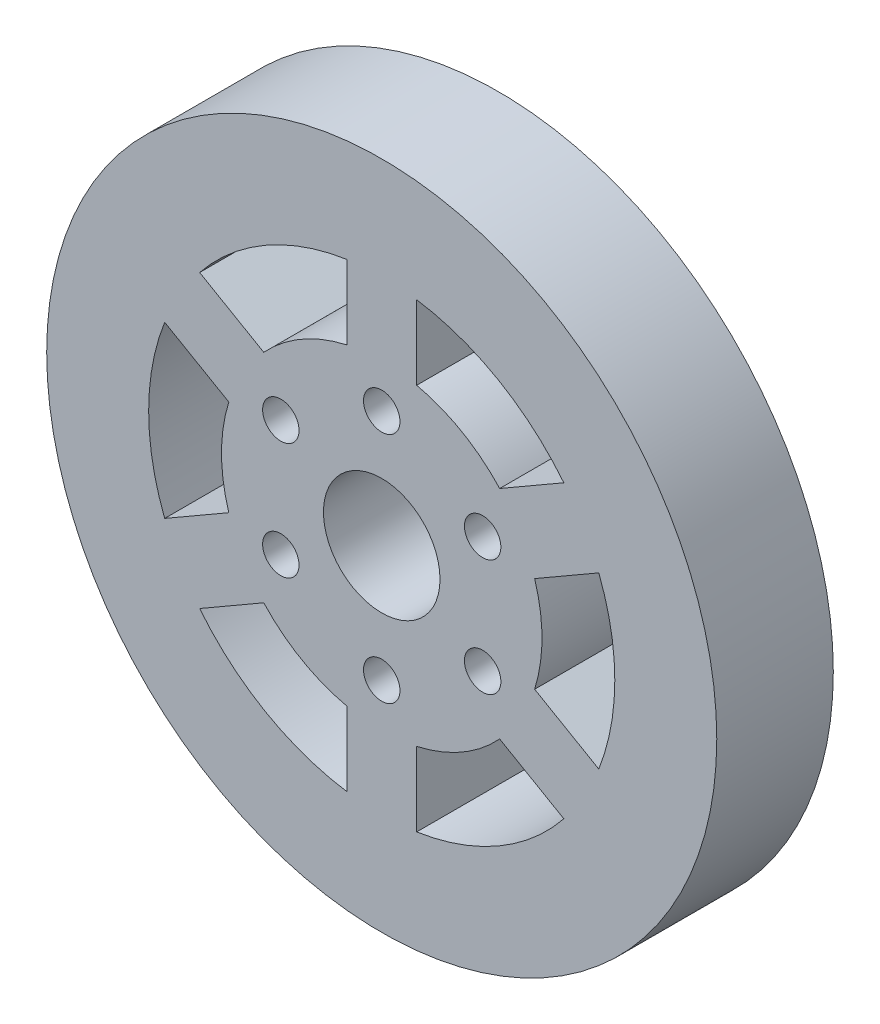
ISO-10303-21;
HEADER;
FILE_DESCRIPTION(('STEP AP214'),'2;1');
FILE_NAME('part.step','',(''),(''),'','','');
FILE_SCHEMA(('AUTOMOTIVE_DESIGN { 1 0 10303 214 1 1 1 1 }'));
ENDSEC;
DATA;
#1=APPLICATION_CONTEXT('core data for automotive mechanical design processes');
#2=APPLICATION_PROTOCOL_DEFINITION('international standard','automotive_design',2000,#1);
#3=PRODUCT_CONTEXT('',#1,'mechanical');
#4=PRODUCT('Part','Part','',(#3));
#5=PRODUCT_RELATED_PRODUCT_CATEGORY('part','',(#4));
#6=PRODUCT_DEFINITION_FORMATION('','',#4);
#7=PRODUCT_DEFINITION_CONTEXT('part definition',#1,'design');
#8=PRODUCT_DEFINITION('design','',#6,#7);
#9=PRODUCT_DEFINITION_SHAPE('','',#8);
#10=(LENGTH_UNIT() NAMED_UNIT(*) SI_UNIT(.MILLI.,.METRE.));
#11=(NAMED_UNIT(*) PLANE_ANGLE_UNIT() SI_UNIT($,.RADIAN.));
#12=(NAMED_UNIT(*) SI_UNIT($,.STERADIAN.) SOLID_ANGLE_UNIT());
#13=UNCERTAINTY_MEASURE_WITH_UNIT(LENGTH_MEASURE(1.E-05),#10,'distance_accuracy_value','');
#14=(GEOMETRIC_REPRESENTATION_CONTEXT(3) GLOBAL_UNCERTAINTY_ASSIGNED_CONTEXT((#13)) GLOBAL_UNIT_ASSIGNED_CONTEXT((#10,
#11,#12)) REPRESENTATION_CONTEXT('',''));
#15=CARTESIAN_POINT('',(0.,0.,0.));
#16=DIRECTION('',(0.,0.,1.));
#17=DIRECTION('',(1.,0.,0.));
#18=AXIS2_PLACEMENT_3D('',#15,#16,#17);
#19=CARTESIAN_POINT('',(0.,0.,-25.4));
#20=DIRECTION('',(0.,0.,1.));
#21=DIRECTION('',(1.,0.,0.));
#22=AXIS2_PLACEMENT_3D('',#19,#20,#21);
#23=PLANE('',#22);
#24=CARTESIAN_POINT('',(-21.9970452561251,12.6999999999999,-25.4));
#25=DIRECTION('',(0.,0.,1.));
#26=DIRECTION('',(1.,0.,0.));
#27=AXIS2_PLACEMENT_3D('',#24,#25,#26);
#28=CIRCLE('',#27,3.96875);
#29=CARTESIAN_POINT('',(-18.0282952561251,12.6999999999999,-25.4));
#30=VERTEX_POINT('',#29);
#31=EDGE_CURVE('E422',#30,#30,#28,.T.);
#32=ORIENTED_EDGE('',*,*,#31,.T.);
#33=EDGE_LOOP('',(#32));
#34=FACE_BOUND('',#33,.T.);
#35=CARTESIAN_POINT('',(-21.997045256125,-12.7,-25.4));
#36=DIRECTION('',(0.,0.,1.));
#37=DIRECTION('',(1.,0.,0.));
#38=AXIS2_PLACEMENT_3D('',#35,#36,#37);
#39=CIRCLE('',#38,3.96875);
#40=CARTESIAN_POINT('',(-18.028295256125,-12.7,-25.4));
#41=VERTEX_POINT('',#40);
#42=EDGE_CURVE('E418',#41,#41,#39,.T.);
#43=ORIENTED_EDGE('',*,*,#42,.T.);
#44=EDGE_LOOP('',(#43));
#45=FACE_BOUND('',#44,.T.);
#46=CARTESIAN_POINT('',(7.16874476447416E-13,-25.4000000000003,-25.4));
#47=DIRECTION('',(0.,0.,1.));
#48=DIRECTION('',(1.,0.,0.));
#49=AXIS2_PLACEMENT_3D('',#46,#47,#48);
#50=CIRCLE('',#49,3.96875);
#51=CARTESIAN_POINT('',(3.96875000000072,-25.4000000000003,-25.4));
#52=VERTEX_POINT('',#51);
#53=EDGE_CURVE('E414',#52,#52,#50,.T.);
#54=ORIENTED_EDGE('',*,*,#53,.T.);
#55=EDGE_LOOP('',(#54));
#56=FACE_BOUND('',#55,.T.);
#57=CARTESIAN_POINT('',(0.,0.,-25.4));
#58=DIRECTION('',(0.,0.,1.));
#59=DIRECTION('',(1.,0.,0.));
#60=AXIS2_PLACEMENT_3D('',#57,#58,#59);
#61=CIRCLE('',#60,34.925);
#62=CARTESIAN_POINT('',(7.62,-34.0835917268119,-25.4));
#63=VERTEX_POINT('',#62);
#64=CARTESIAN_POINT('',(25.7072562876361,-23.6409094402435,-25.4));
#65=VERTEX_POINT('',#64);
#66=EDGE_CURVE('E208',#63,#65,#61,.T.);
#67=ORIENTED_EDGE('',*,*,#66,.F.);
#68=DIRECTION('',(0.,1.,0.));
#69=VECTOR('',#68,1.);
#70=CARTESIAN_POINT('',(7.61999999999999,0.,-25.4));
#71=LINE('',#70,#69);
#72=CARTESIAN_POINT('',(7.62,-50.2252486305444,-25.4));
#73=VERTEX_POINT('',#72);
#74=EDGE_CURVE('E212',#73,#63,#71,.T.);
#75=ORIENTED_EDGE('',*,*,#74,.F.);
#76=CARTESIAN_POINT('',(0.,0.,-25.4));
#77=DIRECTION('',(0.,0.,1.));
#78=DIRECTION('',(1.,0.,0.));
#79=AXIS2_PLACEMENT_3D('',#76,#77,#78);
#80=CIRCLE('',#79,50.8);
#81=CARTESIAN_POINT('',(39.6863412254409,-31.7117378921098,-25.4));
#82=VERTEX_POINT('',#81);
#83=EDGE_CURVE('E217',#73,#82,#80,.T.);
#84=ORIENTED_EDGE('',*,*,#83,.T.);
#85=DIRECTION('',(0.866025403784436,-0.500000000000004,0.));
#86=VECTOR('',#85,1.);
#87=CARTESIAN_POINT('',(-3.81000000000003,-6.5991135768374,-25.4));
#88=LINE('',#87,#86);
#89=EDGE_CURVE('E221',#65,#82,#88,.T.);
#90=ORIENTED_EDGE('',*,*,#89,.F.);
#91=EDGE_LOOP('',(#67,#75,#84,#90));
#92=FACE_BOUND('',#91,.T.);
#93=CARTESIAN_POINT('',(0.,0.,-25.4));
#94=DIRECTION('',(0.,0.,1.));
#95=DIRECTION('',(1.,0.,0.));
#96=AXIS2_PLACEMENT_3D('',#93,#94,#95);
#97=CIRCLE('',#96,34.925);
#98=CARTESIAN_POINT('',(-33.3272562876362,10.4426822865687,-25.4));
#99=VERTEX_POINT('',#98);
#100=CARTESIAN_POINT('',(-33.3272562876362,-10.4426822865687,-25.4));
#101=VERTEX_POINT('',#100);
#102=EDGE_CURVE('E205',#99,#101,#97,.T.);
#103=ORIENTED_EDGE('',*,*,#102,.F.);
#104=DIRECTION('',(0.866025403784436,-0.500000000000004,0.));
#105=VECTOR('',#104,1.);
#106=CARTESIAN_POINT('',(-3.81000000000003,-6.5991135768374,-25.4));
#107=LINE('',#106,#105);
#108=CARTESIAN_POINT('',(-47.3063412254409,18.513510738435,-25.4));
#109=VERTEX_POINT('',#108);
#110=EDGE_CURVE('E461',#109,#99,#107,.T.);
#111=ORIENTED_EDGE('',*,*,#110,.F.);
#112=CARTESIAN_POINT('',(0.,0.,-25.4));
#113=DIRECTION('',(0.,0.,1.));
#114=DIRECTION('',(1.,0.,0.));
#115=AXIS2_PLACEMENT_3D('',#112,#113,#114);
#116=CIRCLE('',#115,50.8);
#117=CARTESIAN_POINT('',(-47.3063412254409,-18.513510738435,-25.4));
#118=VERTEX_POINT('',#117);
#119=EDGE_CURVE('E465',#109,#118,#116,.T.);
#120=ORIENTED_EDGE('',*,*,#119,.T.);
#121=DIRECTION('',(-0.866025403784436,-0.500000000000004,0.));
#122=VECTOR('',#121,1.);
#123=CARTESIAN_POINT('',(-3.81000000000003,6.5991135768374,-25.4));
#124=LINE('',#123,#122);
#125=EDGE_CURVE('E469',#101,#118,#124,.T.);
#126=ORIENTED_EDGE('',*,*,#125,.F.);
#127=EDGE_LOOP('',(#103,#111,#120,#126));
#128=FACE_BOUND('',#127,.T.);
#129=CARTESIAN_POINT('',(0.,0.,-25.4));
#130=DIRECTION('',(0.,0.,1.));
#131=DIRECTION('',(1.,0.,0.));
#132=AXIS2_PLACEMENT_3D('',#129,#130,#131);
#133=CIRCLE('',#132,34.925);
#134=CARTESIAN_POINT('',(25.7072562876361,23.6409094402435,-25.4));
#135=VERTEX_POINT('',#134);
#136=CARTESIAN_POINT('',(7.62,34.0835917268119,-25.4));
#137=VERTEX_POINT('',#136);
#138=EDGE_CURVE('E239',#135,#137,#133,.T.);
#139=ORIENTED_EDGE('',*,*,#138,.F.);
#140=DIRECTION('',(-0.866025403784436,-0.500000000000004,0.));
#141=VECTOR('',#140,1.);
#142=CARTESIAN_POINT('',(-3.81000000000004,6.59911357683743,-25.4));
#143=LINE('',#142,#141);
#144=CARTESIAN_POINT('',(39.6863412254409,31.7117378921098,-25.4));
#145=VERTEX_POINT('',#144);
#146=EDGE_CURVE('E243',#145,#135,#143,.T.);
#147=ORIENTED_EDGE('',*,*,#146,.F.);
#148=CARTESIAN_POINT('',(0.,0.,-25.4));
#149=DIRECTION('',(0.,0.,1.));
#150=DIRECTION('',(1.,0.,0.));
#151=AXIS2_PLACEMENT_3D('',#148,#149,#150);
#152=CIRCLE('',#151,50.8);
#153=CARTESIAN_POINT('',(7.62,50.2252486305444,-25.4));
#154=VERTEX_POINT('',#153);
#155=EDGE_CURVE('E147',#145,#154,#152,.T.);
#156=ORIENTED_EDGE('',*,*,#155,.T.);
#157=DIRECTION('',(0.,1.,0.));
#158=VECTOR('',#157,1.);
#159=CARTESIAN_POINT('',(7.62,0.,-25.4));
#160=LINE('',#159,#158);
#161=EDGE_CURVE('E250',#137,#154,#160,.T.);
#162=ORIENTED_EDGE('',*,*,#161,.F.);
#163=EDGE_LOOP('',(#139,#147,#156,#162));
#164=FACE_BOUND('',#163,.T.);
#165=CARTESIAN_POINT('',(0.,0.,-25.4));
#166=DIRECTION('',(0.,0.,1.));
#167=DIRECTION('',(1.,0.,0.));
#168=AXIS2_PLACEMENT_3D('',#165,#166,#167);
#169=CIRCLE('',#168,73.025);
#170=CARTESIAN_POINT('',(73.025,0.,-25.4));
#171=VERTEX_POINT('',#170);
#172=EDGE_CURVE('E269',#171,#171,#169,.T.);
#173=ORIENTED_EDGE('',*,*,#172,.F.);
#174=EDGE_LOOP('',(#173));
#175=FACE_BOUND('',#174,.T.);
#176=CARTESIAN_POINT('',(0.,25.4000000000003,-25.4));
#177=DIRECTION('',(0.,0.,1.));
#178=DIRECTION('',(1.,0.,0.));
#179=AXIS2_PLACEMENT_3D('',#176,#177,#178);
#180=CIRCLE('',#179,3.96875);
#181=CARTESIAN_POINT('',(3.96875,25.4000000000003,-25.4));
#182=VERTEX_POINT('',#181);
#183=EDGE_CURVE('E426',#182,#182,#180,.T.);
#184=ORIENTED_EDGE('',*,*,#183,.T.);
#185=EDGE_LOOP('',(#184));
#186=FACE_BOUND('',#185,.T.);
#187=CARTESIAN_POINT('',(21.9970452561248,12.7000000000005,-25.4));
#188=DIRECTION('',(0.,0.,1.));
#189=DIRECTION('',(1.,0.,0.));
#190=AXIS2_PLACEMENT_3D('',#187,#188,#189);
#191=CIRCLE('',#190,3.96875);
#192=CARTESIAN_POINT('',(25.9657952561248,12.7000000000005,-25.4));
#193=VERTEX_POINT('',#192);
#194=EDGE_CURVE('E577',#193,#193,#191,.T.);
#195=ORIENTED_EDGE('',*,*,#194,.T.);
#196=EDGE_LOOP('',(#195));
#197=FACE_BOUND('',#196,.T.);
#198=CARTESIAN_POINT('',(21.9970452561247,-12.7000000000005,-25.4));
#199=DIRECTION('',(0.,0.,1.));
#200=DIRECTION('',(1.,0.,0.));
#201=AXIS2_PLACEMENT_3D('',#198,#199,#200);
#202=CIRCLE('',#201,3.96875);
#203=CARTESIAN_POINT('',(25.9657952561247,-12.7000000000005,-25.4));
#204=VERTEX_POINT('',#203);
#205=EDGE_CURVE('E585',#204,#204,#202,.T.);
#206=ORIENTED_EDGE('',*,*,#205,.T.);
#207=EDGE_LOOP('',(#206));
#208=FACE_BOUND('',#207,.T.);
#209=CARTESIAN_POINT('',(0.,0.,-25.4));
#210=DIRECTION('',(0.,0.,1.));
#211=DIRECTION('',(1.,0.,0.));
#212=AXIS2_PLACEMENT_3D('',#209,#210,#211);
#213=CIRCLE('',#212,12.7000000000003);
#214=CARTESIAN_POINT('',(12.7000000000003,0.,-25.4));
#215=VERTEX_POINT('',#214);
#216=EDGE_CURVE('E589',#215,#215,#213,.T.);
#217=ORIENTED_EDGE('',*,*,#216,.T.);
#218=EDGE_LOOP('',(#217));
#219=FACE_BOUND('',#218,.T.);
#220=CARTESIAN_POINT('',(0.,0.,-25.4));
#221=DIRECTION('',(0.,0.,1.));
#222=DIRECTION('',(1.,0.,0.));
#223=AXIS2_PLACEMENT_3D('',#220,#221,#222);
#224=CIRCLE('',#223,34.925);
#225=CARTESIAN_POINT('',(-7.62,34.0835917268119,-25.4));
#226=VERTEX_POINT('',#225);
#227=CARTESIAN_POINT('',(-25.7072562876361,23.6409094402435,-25.4));
#228=VERTEX_POINT('',#227);
#229=EDGE_CURVE('E427',#226,#228,#224,.T.);
#230=ORIENTED_EDGE('',*,*,#229,.F.);
#231=DIRECTION('',(0.,1.,0.));
#232=VECTOR('',#231,1.);
#233=CARTESIAN_POINT('',(-7.61999999999999,0.,-25.4));
#234=LINE('',#233,#232);
#235=CARTESIAN_POINT('',(-7.62,50.2252486305444,-25.4));
#236=VERTEX_POINT('',#235);
#237=EDGE_CURVE('E431',#226,#236,#234,.T.);
#238=ORIENTED_EDGE('',*,*,#237,.T.);
#239=CARTESIAN_POINT('',(0.,0.,-25.4));
#240=DIRECTION('',(0.,0.,1.));
#241=DIRECTION('',(1.,0.,0.));
#242=AXIS2_PLACEMENT_3D('',#239,#240,#241);
#243=CIRCLE('',#242,50.8);
#244=CARTESIAN_POINT('',(-39.6863412254409,31.7117378921098,-25.4));
#245=VERTEX_POINT('',#244);
#246=EDGE_CURVE('E436',#236,#245,#243,.T.);
#247=ORIENTED_EDGE('',*,*,#246,.T.);
#248=DIRECTION('',(0.866025403784436,-0.500000000000004,0.));
#249=VECTOR('',#248,1.);
#250=CARTESIAN_POINT('',(3.81000000000002,6.59911357683739,-25.4));
#251=LINE('',#250,#249);
#252=EDGE_CURVE('E440',#245,#228,#251,.T.);
#253=ORIENTED_EDGE('',*,*,#252,.T.);
#254=EDGE_LOOP('',(#230,#238,#247,#253));
#255=FACE_BOUND('',#254,.T.);
#256=CARTESIAN_POINT('',(0.,0.,-25.4));
#257=DIRECTION('',(0.,0.,1.));
#258=DIRECTION('',(1.,0.,0.));
#259=AXIS2_PLACEMENT_3D('',#256,#257,#258);
#260=CIRCLE('',#259,34.925);
#261=CARTESIAN_POINT('',(-25.7072562876361,-23.6409094402435,-25.4));
#262=VERTEX_POINT('',#261);
#263=CARTESIAN_POINT('',(-7.62,-34.0835917268119,-25.4));
#264=VERTEX_POINT('',#263);
#265=EDGE_CURVE('E189',#262,#264,#260,.T.);
#266=ORIENTED_EDGE('',*,*,#265,.F.);
#267=DIRECTION('',(-0.866025403784436,-0.500000000000004,0.));
#268=VECTOR('',#267,1.);
#269=CARTESIAN_POINT('',(3.81000000000003,-6.59911357683741,-25.4));
#270=LINE('',#269,#268);
#271=CARTESIAN_POINT('',(-39.6863412254409,-31.7117378921098,-25.4));
#272=VERTEX_POINT('',#271);
#273=EDGE_CURVE('E175',#262,#272,#270,.T.);
#274=ORIENTED_EDGE('',*,*,#273,.T.);
#275=CARTESIAN_POINT('',(0.,0.,-25.4));
#276=DIRECTION('',(0.,0.,1.));
#277=DIRECTION('',(1.,0.,0.));
#278=AXIS2_PLACEMENT_3D('',#275,#276,#277);
#279=CIRCLE('',#278,50.8);
#280=CARTESIAN_POINT('',(-7.62,-50.2252486305444,-25.4));
#281=VERTEX_POINT('',#280);
#282=EDGE_CURVE('E161',#272,#281,#279,.T.);
#283=ORIENTED_EDGE('',*,*,#282,.T.);
#284=DIRECTION('',(0.,1.,0.));
#285=VECTOR('',#284,1.);
#286=CARTESIAN_POINT('',(-7.62,0.,-25.4));
#287=LINE('',#286,#285);
#288=EDGE_CURVE('E174',#281,#264,#287,.T.);
#289=ORIENTED_EDGE('',*,*,#288,.T.);
#290=EDGE_LOOP('',(#266,#274,#283,#289));
#291=FACE_BOUND('',#290,.T.);
#292=CARTESIAN_POINT('',(0.,0.,-25.4));
#293=DIRECTION('',(0.,0.,1.));
#294=DIRECTION('',(1.,0.,0.));
#295=AXIS2_PLACEMENT_3D('',#292,#293,#294);
#296=CIRCLE('',#295,34.925);
#297=CARTESIAN_POINT('',(33.3272562876362,-10.4426822865687,-25.4));
#298=VERTEX_POINT('',#297);
#299=CARTESIAN_POINT('',(33.3272562876362,10.4426822865685,-25.4));
#300=VERTEX_POINT('',#299);
#301=EDGE_CURVE('E398',#298,#300,#296,.T.);
#302=ORIENTED_EDGE('',*,*,#301,.F.);
#303=DIRECTION('',(0.866025403784436,-0.500000000000004,0.));
#304=VECTOR('',#303,1.);
#305=CARTESIAN_POINT('',(3.81000000000003,6.5991135768374,-25.4));
#306=LINE('',#305,#304);
#307=CARTESIAN_POINT('',(47.3063412254409,-18.513510738435,-25.4));
#308=VERTEX_POINT('',#307);
#309=EDGE_CURVE('E571',#298,#308,#306,.T.);
#310=ORIENTED_EDGE('',*,*,#309,.T.);
#311=CARTESIAN_POINT('',(0.,0.,-25.4));
#312=DIRECTION('',(0.,0.,1.));
#313=DIRECTION('',(1.,0.,0.));
#314=AXIS2_PLACEMENT_3D('',#311,#312,#313);
#315=CIRCLE('',#314,50.8);
#316=CARTESIAN_POINT('',(47.3063412254409,18.513510738435,-25.4));
#317=VERTEX_POINT('',#316);
#318=EDGE_CURVE('E59',#308,#317,#315,.T.);
#319=ORIENTED_EDGE('',*,*,#318,.T.);
#320=DIRECTION('',(-0.866025403784432,-0.500000000000012,0.));
#321=VECTOR('',#320,1.);
#322=CARTESIAN_POINT('',(3.81000000000031,-6.59911357683775,-25.4));
#323=LINE('',#322,#321);
#324=EDGE_CURVE('E411',#317,#300,#323,.T.);
#325=ORIENTED_EDGE('',*,*,#324,.T.);
#326=EDGE_LOOP('',(#302,#310,#319,#325));
#327=FACE_BOUND('',#326,.T.);
#328=ADVANCED_FACE('F41',(#34,#45,#56,#92,#128,#164,#175,#186,#197,#208,#219,#255,#291,#327),
#23,.F.);
#329=CARTESIAN_POINT('',(0.,0.,0.));
#330=DIRECTION('',(0.,0.,1.));
#331=DIRECTION('',(1.,0.,0.));
#332=AXIS2_PLACEMENT_3D('',#329,#330,#331);
#333=PLANE('',#332);
#334=CARTESIAN_POINT('',(-21.9970452561251,12.6999999999999,0.));
#335=DIRECTION('',(0.,0.,1.));
#336=DIRECTION('',(1.,0.,0.));
#337=AXIS2_PLACEMENT_3D('',#334,#335,#336);
#338=CIRCLE('',#337,3.96875);
#339=CARTESIAN_POINT('',(-18.0282952561251,12.6999999999999,0.));
#340=VERTEX_POINT('',#339);
#341=EDGE_CURVE('E278',#340,#340,#338,.T.);
#342=ORIENTED_EDGE('',*,*,#341,.F.);
#343=EDGE_LOOP('',(#342));
#344=FACE_BOUND('',#343,.T.);
#345=CARTESIAN_POINT('',(-21.997045256125,-12.7,0.));
#346=DIRECTION('',(0.,0.,1.));
#347=DIRECTION('',(1.,0.,0.));
#348=AXIS2_PLACEMENT_3D('',#345,#346,#347);
#349=CIRCLE('',#348,3.96875);
#350=CARTESIAN_POINT('',(-18.028295256125,-12.7,0.));
#351=VERTEX_POINT('',#350);
#352=EDGE_CURVE('E298',#351,#351,#349,.T.);
#353=ORIENTED_EDGE('',*,*,#352,.F.);
#354=EDGE_LOOP('',(#353));
#355=FACE_BOUND('',#354,.T.);
#356=CARTESIAN_POINT('',(7.16874476447416E-13,-25.4000000000003,0.));
#357=DIRECTION('',(0.,0.,1.));
#358=DIRECTION('',(1.,0.,0.));
#359=AXIS2_PLACEMENT_3D('',#356,#357,#358);
#360=CIRCLE('',#359,3.96875);
#361=CARTESIAN_POINT('',(3.96875000000072,-25.4000000000003,0.));
#362=VERTEX_POINT('',#361);
#363=EDGE_CURVE('E294',#362,#362,#360,.T.);
#364=ORIENTED_EDGE('',*,*,#363,.F.);
#365=EDGE_LOOP('',(#364));
#366=FACE_BOUND('',#365,.T.);
#367=CARTESIAN_POINT('',(0.,0.,0.));
#368=DIRECTION('',(0.,0.,1.));
#369=DIRECTION('',(1.,0.,0.));
#370=AXIS2_PLACEMENT_3D('',#367,#368,#369);
#371=CIRCLE('',#370,12.7000000000003);
#372=CARTESIAN_POINT('',(12.7000000000003,0.,0.));
#373=VERTEX_POINT('',#372);
#374=EDGE_CURVE('E290',#373,#373,#371,.T.);
#375=ORIENTED_EDGE('',*,*,#374,.F.);
#376=EDGE_LOOP('',(#375));
#377=FACE_BOUND('',#376,.T.);
#378=CARTESIAN_POINT('',(21.9970452561247,-12.7000000000005,0.));
#379=DIRECTION('',(0.,0.,1.));
#380=DIRECTION('',(1.,0.,0.));
#381=AXIS2_PLACEMENT_3D('',#378,#379,#380);
#382=CIRCLE('',#381,3.96875);
#383=CARTESIAN_POINT('',(25.9657952561247,-12.7000000000005,0.));
#384=VERTEX_POINT('',#383);
#385=EDGE_CURVE('E286',#384,#384,#382,.T.);
#386=ORIENTED_EDGE('',*,*,#385,.F.);
#387=EDGE_LOOP('',(#386));
#388=FACE_BOUND('',#387,.T.);
#389=CARTESIAN_POINT('',(21.9970452561248,12.7000000000005,0.));
#390=DIRECTION('',(0.,0.,1.));
#391=DIRECTION('',(1.,0.,0.));
#392=AXIS2_PLACEMENT_3D('',#389,#390,#391);
#393=CIRCLE('',#392,3.96875);
#394=CARTESIAN_POINT('',(25.9657952561248,12.7000000000005,0.));
#395=VERTEX_POINT('',#394);
#396=EDGE_CURVE('E282',#395,#395,#393,.T.);
#397=ORIENTED_EDGE('',*,*,#396,.F.);
#398=EDGE_LOOP('',(#397));
#399=FACE_BOUND('',#398,.T.);
#400=CARTESIAN_POINT('',(0.,25.4000000000003,0.));
#401=DIRECTION('',(0.,0.,1.));
#402=DIRECTION('',(1.,0.,0.));
#403=AXIS2_PLACEMENT_3D('',#400,#401,#402);
#404=CIRCLE('',#403,3.96875);
#405=CARTESIAN_POINT('',(3.96875,25.4000000000003,0.));
#406=VERTEX_POINT('',#405);
#407=EDGE_CURVE('E259',#406,#406,#404,.T.);
#408=ORIENTED_EDGE('',*,*,#407,.F.);
#409=EDGE_LOOP('',(#408));
#410=FACE_BOUND('',#409,.T.);
#411=CARTESIAN_POINT('',(0.,0.,0.));
#412=DIRECTION('',(0.,0.,1.));
#413=DIRECTION('',(1.,0.,0.));
#414=AXIS2_PLACEMENT_3D('',#411,#412,#413);
#415=CIRCLE('',#414,73.025);
#416=CARTESIAN_POINT('',(73.025,0.,0.));
#417=VERTEX_POINT('',#416);
#418=EDGE_CURVE('E274',#417,#417,#415,.T.);
#419=ORIENTED_EDGE('',*,*,#418,.T.);
#420=EDGE_LOOP('',(#419));
#421=FACE_BOUND('',#420,.T.);
#422=DIRECTION('',(-0.866025403784436,-0.500000000000004,0.));
#423=VECTOR('',#422,1.);
#424=CARTESIAN_POINT('',(39.6863412254409,31.7117378921098,0.));
#425=LINE('',#424,#423);
#426=CARTESIAN_POINT('',(39.6863412254409,31.7117378921098,0.));
#427=VERTEX_POINT('',#426);
#428=CARTESIAN_POINT('',(25.7072562876361,23.6409094402435,0.));
#429=VERTEX_POINT('',#428);
#430=EDGE_CURVE('E273',#427,#429,#425,.T.);
#431=ORIENTED_EDGE('',*,*,#430,.T.);
#432=CARTESIAN_POINT('',(0.,0.,0.));
#433=DIRECTION('',(0.,0.,1.));
#434=DIRECTION('',(1.,0.,0.));
#435=AXIS2_PLACEMENT_3D('',#432,#433,#434);
#436=CIRCLE('',#435,34.925);
#437=CARTESIAN_POINT('',(7.62,34.0835917268119,0.));
#438=VERTEX_POINT('',#437);
#439=EDGE_CURVE('E315',#429,#438,#436,.T.);
#440=ORIENTED_EDGE('',*,*,#439,.T.);
#441=DIRECTION('',(0.,1.,0.));
#442=VECTOR('',#441,1.);
#443=CARTESIAN_POINT('',(7.62,0.,0.));
#444=LINE('',#443,#442);
#445=CARTESIAN_POINT('',(7.62,50.2252486305444,0.));
#446=VERTEX_POINT('',#445);
#447=EDGE_CURVE('E311',#438,#446,#444,.T.);
#448=ORIENTED_EDGE('',*,*,#447,.T.);
#449=CARTESIAN_POINT('',(0.,0.,0.));
#450=DIRECTION('',(0.,0.,1.));
#451=DIRECTION('',(1.,0.,0.));
#452=AXIS2_PLACEMENT_3D('',#449,#450,#451);
#453=CIRCLE('',#452,50.8);
#454=EDGE_CURVE('E308',#427,#446,#453,.T.);
#455=ORIENTED_EDGE('',*,*,#454,.F.);
#456=EDGE_LOOP('',(#431,#440,#448,#455));
#457=FACE_BOUND('',#456,.T.);
#458=DIRECTION('',(0.,1.,0.));
#459=VECTOR('',#458,1.);
#460=CARTESIAN_POINT('',(-7.61999999999999,0.,0.));
#461=LINE('',#460,#459);
#462=CARTESIAN_POINT('',(-7.62,34.0835917268119,0.));
#463=VERTEX_POINT('',#462);
#464=CARTESIAN_POINT('',(-7.62,50.2252486305444,0.));
#465=VERTEX_POINT('',#464);
#466=EDGE_CURVE('E319',#463,#465,#461,.T.);
#467=ORIENTED_EDGE('',*,*,#466,.F.);
#468=CARTESIAN_POINT('',(0.,0.,0.));
#469=DIRECTION('',(0.,0.,1.));
#470=DIRECTION('',(1.,0.,0.));
#471=AXIS2_PLACEMENT_3D('',#468,#469,#470);
#472=CIRCLE('',#471,34.925);
#473=CARTESIAN_POINT('',(-25.7072562876361,23.6409094402435,0.));
#474=VERTEX_POINT('',#473);
#475=EDGE_CURVE('E328',#463,#474,#472,.T.);
#476=ORIENTED_EDGE('',*,*,#475,.T.);
#477=DIRECTION('',(0.866025403784436,-0.500000000000004,0.));
#478=VECTOR('',#477,1.);
#479=CARTESIAN_POINT('',(3.81000000000002,6.59911357683739,0.));
#480=LINE('',#479,#478);
#481=CARTESIAN_POINT('',(-39.6863412254409,31.7117378921098,0.));
#482=VERTEX_POINT('',#481);
#483=EDGE_CURVE('E325',#482,#474,#480,.T.);
#484=ORIENTED_EDGE('',*,*,#483,.F.);
#485=CARTESIAN_POINT('',(0.,0.,0.));
#486=DIRECTION('',(0.,0.,1.));
#487=DIRECTION('',(1.,0.,0.));
#488=AXIS2_PLACEMENT_3D('',#485,#486,#487);
#489=CIRCLE('',#488,50.8);
#490=EDGE_CURVE('E322',#465,#482,#489,.T.);
#491=ORIENTED_EDGE('',*,*,#490,.F.);
#492=EDGE_LOOP('',(#467,#476,#484,#491));
#493=FACE_BOUND('',#492,.T.);
#494=DIRECTION('',(0.866025403784436,-0.500000000000003,0.));
#495=VECTOR('',#494,1.);
#496=CARTESIAN_POINT('',(-47.306341225441,18.513510738435,0.));
#497=LINE('',#496,#495);
#498=CARTESIAN_POINT('',(-47.3063412254409,18.513510738435,0.));
#499=VERTEX_POINT('',#498);
#500=CARTESIAN_POINT('',(-33.3272562876362,10.4426822865687,0.));
#501=VERTEX_POINT('',#500);
#502=EDGE_CURVE('E332',#499,#501,#497,.T.);
#503=ORIENTED_EDGE('',*,*,#502,.T.);
#504=CARTESIAN_POINT('',(0.,0.,0.));
#505=DIRECTION('',(0.,0.,1.));
#506=DIRECTION('',(1.,0.,0.));
#507=AXIS2_PLACEMENT_3D('',#504,#505,#506);
#508=CIRCLE('',#507,34.925);
#509=CARTESIAN_POINT('',(-33.3272562876362,-10.4426822865687,0.));
#510=VERTEX_POINT('',#509);
#511=EDGE_CURVE('E343',#501,#510,#508,.T.);
#512=ORIENTED_EDGE('',*,*,#511,.T.);
#513=DIRECTION('',(-0.866025403784436,-0.500000000000004,0.));
#514=VECTOR('',#513,1.);
#515=CARTESIAN_POINT('',(-33.3272562876362,-10.4426822865687,0.));
#516=LINE('',#515,#514);
#517=CARTESIAN_POINT('',(-47.3063412254409,-18.513510738435,0.));
#518=VERTEX_POINT('',#517);
#519=EDGE_CURVE('E339',#510,#518,#516,.T.);
#520=ORIENTED_EDGE('',*,*,#519,.T.);
#521=CARTESIAN_POINT('',(0.,0.,0.));
#522=DIRECTION('',(0.,0.,1.));
#523=DIRECTION('',(1.,0.,0.));
#524=AXIS2_PLACEMENT_3D('',#521,#522,#523);
#525=CIRCLE('',#524,50.8);
#526=EDGE_CURVE('E336',#499,#518,#525,.T.);
#527=ORIENTED_EDGE('',*,*,#526,.F.);
#528=EDGE_LOOP('',(#503,#512,#520,#527));
#529=FACE_BOUND('',#528,.T.);
#530=DIRECTION('',(-0.866025403784436,-0.500000000000004,0.));
#531=VECTOR('',#530,1.);
#532=CARTESIAN_POINT('',(3.81000000000003,-6.59911357683741,0.));
#533=LINE('',#532,#531);
#534=CARTESIAN_POINT('',(-25.7072562876361,-23.6409094402435,0.));
#535=VERTEX_POINT('',#534);
#536=CARTESIAN_POINT('',(-39.6863412254409,-31.7117378921098,0.));
#537=VERTEX_POINT('',#536);
#538=EDGE_CURVE('E183',#535,#537,#533,.T.);
#539=ORIENTED_EDGE('',*,*,#538,.F.);
#540=CARTESIAN_POINT('',(0.,0.,0.));
#541=DIRECTION('',(0.,0.,1.));
#542=DIRECTION('',(1.,0.,0.));
#543=AXIS2_PLACEMENT_3D('',#540,#541,#542);
#544=CIRCLE('',#543,34.925);
#545=CARTESIAN_POINT('',(-7.62,-34.0835917268119,0.));
#546=VERTEX_POINT('',#545);
#547=EDGE_CURVE('E355',#535,#546,#544,.T.);
#548=ORIENTED_EDGE('',*,*,#547,.T.);
#549=DIRECTION('',(0.,1.,0.));
#550=VECTOR('',#549,1.);
#551=CARTESIAN_POINT('',(-7.62,0.,0.));
#552=LINE('',#551,#550);
#553=CARTESIAN_POINT('',(-7.62,-50.2252486305444,0.));
#554=VERTEX_POINT('',#553);
#555=EDGE_CURVE('E352',#554,#546,#552,.T.);
#556=ORIENTED_EDGE('',*,*,#555,.F.);
#557=CARTESIAN_POINT('',(0.,0.,0.));
#558=DIRECTION('',(0.,0.,1.));
#559=DIRECTION('',(1.,0.,0.));
#560=AXIS2_PLACEMENT_3D('',#557,#558,#559);
#561=CIRCLE('',#560,50.8);
#562=EDGE_CURVE('E349',#537,#554,#561,.T.);
#563=ORIENTED_EDGE('',*,*,#562,.F.);
#564=EDGE_LOOP('',(#539,#548,#556,#563));
#565=FACE_BOUND('',#564,.T.);
#566=DIRECTION('',(0.,1.,0.));
#567=VECTOR('',#566,1.);
#568=CARTESIAN_POINT('',(7.62,0.,0.));
#569=LINE('',#568,#567);
#570=CARTESIAN_POINT('',(7.62,-50.2252486305444,0.));
#571=VERTEX_POINT('',#570);
#572=CARTESIAN_POINT('',(7.62,-34.0835917268119,0.));
#573=VERTEX_POINT('',#572);
#574=EDGE_CURVE('E359',#571,#573,#569,.T.);
#575=ORIENTED_EDGE('',*,*,#574,.T.);
#576=CARTESIAN_POINT('',(0.,0.,0.));
#577=DIRECTION('',(0.,0.,1.));
#578=DIRECTION('',(1.,0.,0.));
#579=AXIS2_PLACEMENT_3D('',#576,#577,#578);
#580=CIRCLE('',#579,34.925);
#581=CARTESIAN_POINT('',(25.7072562876361,-23.6409094402435,0.));
#582=VERTEX_POINT('',#581);
#583=EDGE_CURVE('E370',#573,#582,#580,.T.);
#584=ORIENTED_EDGE('',*,*,#583,.T.);
#585=DIRECTION('',(0.866025403784436,-0.500000000000004,0.));
#586=VECTOR('',#585,1.);
#587=CARTESIAN_POINT('',(25.7072562876361,-23.6409094402435,0.));
#588=LINE('',#587,#586);
#589=CARTESIAN_POINT('',(39.6863412254409,-31.7117378921098,0.));
#590=VERTEX_POINT('',#589);
#591=EDGE_CURVE('E366',#582,#590,#588,.T.);
#592=ORIENTED_EDGE('',*,*,#591,.T.);
#593=CARTESIAN_POINT('',(0.,0.,0.));
#594=DIRECTION('',(0.,0.,1.));
#595=DIRECTION('',(1.,0.,0.));
#596=AXIS2_PLACEMENT_3D('',#593,#594,#595);
#597=CIRCLE('',#596,50.8);
#598=EDGE_CURVE('E363',#571,#590,#597,.T.);
#599=ORIENTED_EDGE('',*,*,#598,.F.);
#600=EDGE_LOOP('',(#575,#584,#592,#599));
#601=FACE_BOUND('',#600,.T.);
#602=DIRECTION('',(0.866025403784437,-0.500000000000004,0.));
#603=VECTOR('',#602,1.);
#604=CARTESIAN_POINT('',(3.81000000000003,6.5991135768374,0.));
#605=LINE('',#604,#603);
#606=CARTESIAN_POINT('',(33.3272562876362,-10.4426822865687,0.));
#607=VERTEX_POINT('',#606);
#608=CARTESIAN_POINT('',(47.3063412254409,-18.513510738435,0.));
#609=VERTEX_POINT('',#608);
#610=EDGE_CURVE('E374',#607,#609,#605,.T.);
#611=ORIENTED_EDGE('',*,*,#610,.F.);
#612=CARTESIAN_POINT('',(0.,0.,0.));
#613=DIRECTION('',(0.,0.,1.));
#614=DIRECTION('',(1.,0.,0.));
#615=AXIS2_PLACEMENT_3D('',#612,#613,#614);
#616=CIRCLE('',#615,34.925);
#617=CARTESIAN_POINT('',(33.3272562876362,10.4426822865685,0.));
#618=VERTEX_POINT('',#617);
#619=EDGE_CURVE('E11',#607,#618,#616,.T.);
#620=ORIENTED_EDGE('',*,*,#619,.T.);
#621=DIRECTION('',(-0.866025403784432,-0.500000000000012,0.));
#622=VECTOR('',#621,1.);
#623=CARTESIAN_POINT('',(3.81000000000031,-6.59911357683775,0.));
#624=LINE('',#623,#622);
#625=CARTESIAN_POINT('',(47.3063412254409,18.513510738435,0.));
#626=VERTEX_POINT('',#625);
#627=EDGE_CURVE('E51',#626,#618,#624,.T.);
#628=ORIENTED_EDGE('',*,*,#627,.F.);
#629=CARTESIAN_POINT('',(0.,0.,0.));
#630=DIRECTION('',(0.,0.,1.));
#631=DIRECTION('',(1.,0.,0.));
#632=AXIS2_PLACEMENT_3D('',#629,#630,#631);
#633=CIRCLE('',#632,50.8);
#634=EDGE_CURVE('E377',#609,#626,#633,.T.);
#635=ORIENTED_EDGE('',*,*,#634,.F.);
#636=EDGE_LOOP('',(#611,#620,#628,#635));
#637=FACE_BOUND('',#636,.T.);
#638=ADVANCED_FACE('F401',(#344,#355,#366,#377,#388,#399,#410,#421,#457,#493,#529,#565,#601,
#637),#333,.T.);
#639=CARTESIAN_POINT('',(0.,0.,-25.4));
#640=DIRECTION('',(0.,0.,1.));
#641=DIRECTION('',(1.,0.,0.));
#642=AXIS2_PLACEMENT_3D('',#639,#640,#641);
#643=CYLINDRICAL_SURFACE('',#642,73.025);
#644=ORIENTED_EDGE('',*,*,#172,.T.);
#645=EDGE_LOOP('',(#644));
#646=FACE_BOUND('',#645,.T.);
#647=ORIENTED_EDGE('',*,*,#418,.F.);
#648=EDGE_LOOP('',(#647));
#649=FACE_BOUND('',#648,.T.);
#650=ADVANCED_FACE('F43',(#646,#649),#643,.T.);
#651=CARTESIAN_POINT('',(0.,0.,-25.4));
#652=DIRECTION('',(0.,0.,1.));
#653=DIRECTION('',(1.,0.,0.));
#654=AXIS2_PLACEMENT_3D('',#651,#652,#653);
#655=CYLINDRICAL_SURFACE('',#654,34.925);
#656=DIRECTION('',(0.,0.,1.));
#657=VECTOR('',#656,1.);
#658=CARTESIAN_POINT('',(25.7072562876361,23.6409094402435,-25.4));
#659=LINE('',#658,#657);
#660=EDGE_CURVE('E254',#135,#429,#659,.T.);
#661=ORIENTED_EDGE('',*,*,#660,.F.);
#662=ORIENTED_EDGE('',*,*,#138,.T.);
#663=DIRECTION('',(0.,0.,1.));
#664=VECTOR('',#663,1.);
#665=CARTESIAN_POINT('',(7.62,34.0835917268119,-25.4));
#666=LINE('',#665,#664);
#667=EDGE_CURVE('E255',#137,#438,#666,.T.);
#668=ORIENTED_EDGE('',*,*,#667,.T.);
#669=ORIENTED_EDGE('',*,*,#439,.F.);
#670=EDGE_LOOP('',(#661,#662,#668,#669));
#671=FACE_BOUND('',#670,.T.);
#672=ADVANCED_FACE('F537',(#671),#655,.T.);
#673=CARTESIAN_POINT('',(7.62,0.,-25.4));
#674=DIRECTION('',(1.,0.,0.));
#675=DIRECTION('',(0.,1.,0.));
#676=AXIS2_PLACEMENT_3D('',#673,#674,#675);
#677=PLANE('',#676);
#678=ORIENTED_EDGE('',*,*,#667,.F.);
#679=ORIENTED_EDGE('',*,*,#161,.T.);
#680=DIRECTION('',(0.,0.,1.));
#681=VECTOR('',#680,1.);
#682=CARTESIAN_POINT('',(7.62,50.2252486305444,-25.4));
#683=LINE('',#682,#681);
#684=EDGE_CURVE('E260',#154,#446,#683,.T.);
#685=ORIENTED_EDGE('',*,*,#684,.T.);
#686=ORIENTED_EDGE('',*,*,#447,.F.);
#687=EDGE_LOOP('',(#678,#679,#685,#686));
#688=FACE_BOUND('',#687,.T.);
#689=ADVANCED_FACE('F540',(#688),#677,.T.);
#690=CARTESIAN_POINT('',(0.,0.,-25.4));
#691=DIRECTION('',(0.,0.,1.));
#692=DIRECTION('',(1.,0.,0.));
#693=AXIS2_PLACEMENT_3D('',#690,#691,#692);
#694=CYLINDRICAL_SURFACE('',#693,50.8);
#695=ORIENTED_EDGE('',*,*,#454,.T.);
#696=ORIENTED_EDGE('',*,*,#684,.F.);
#697=ORIENTED_EDGE('',*,*,#155,.F.);
#698=DIRECTION('',(0.,0.,1.));
#699=VECTOR('',#698,1.);
#700=CARTESIAN_POINT('',(39.6863412254409,31.7117378921098,-25.4));
#701=LINE('',#700,#699);
#702=EDGE_CURVE('E264',#145,#427,#701,.T.);
#703=ORIENTED_EDGE('',*,*,#702,.T.);
#704=EDGE_LOOP('',(#695,#696,#697,#703));
#705=FACE_BOUND('',#704,.T.);
#706=ADVANCED_FACE('F545',(#705),#694,.F.);
#707=CARTESIAN_POINT('',(-3.81000000000004,6.59911357683743,-25.4));
#708=DIRECTION('',(-0.500000000000004,0.866025403784436,0.));
#709=DIRECTION('',(-0.866025403784437,-0.500000000000004,0.));
#710=AXIS2_PLACEMENT_3D('',#707,#708,#709);
#711=PLANE('',#710);
#712=ORIENTED_EDGE('',*,*,#702,.F.);
#713=ORIENTED_EDGE('',*,*,#146,.T.);
#714=ORIENTED_EDGE('',*,*,#660,.T.);
#715=ORIENTED_EDGE('',*,*,#430,.F.);
#716=EDGE_LOOP('',(#712,#713,#714,#715));
#717=FACE_BOUND('',#716,.T.);
#718=ADVANCED_FACE('F543',(#717),#711,.T.);
#719=CARTESIAN_POINT('',(0.,25.4000000000003,-25.4));
#720=DIRECTION('',(0.,0.,1.));
#721=DIRECTION('',(1.,0.,0.));
#722=AXIS2_PLACEMENT_3D('',#719,#720,#721);
#723=CYLINDRICAL_SURFACE('',#722,3.96875);
#724=ORIENTED_EDGE('',*,*,#407,.T.);
#725=EDGE_LOOP('',(#724));
#726=FACE_BOUND('',#725,.T.);
#727=ORIENTED_EDGE('',*,*,#183,.F.);
#728=EDGE_LOOP('',(#727));
#729=FACE_BOUND('',#728,.T.);
#730=ADVANCED_FACE('F612',(#726,#729),#723,.F.);
#731=CARTESIAN_POINT('',(21.9970452561248,12.7000000000005,-25.4));
#732=DIRECTION('',(0.,0.,1.));
#733=DIRECTION('',(1.,0.,0.));
#734=AXIS2_PLACEMENT_3D('',#731,#732,#733);
#735=CYLINDRICAL_SURFACE('',#734,3.96875);
#736=ORIENTED_EDGE('',*,*,#396,.T.);
#737=EDGE_LOOP('',(#736));
#738=FACE_BOUND('',#737,.T.);
#739=ORIENTED_EDGE('',*,*,#194,.F.);
#740=EDGE_LOOP('',(#739));
#741=FACE_BOUND('',#740,.T.);
#742=ADVANCED_FACE('F602',(#738,#741),#735,.F.);
#743=CARTESIAN_POINT('',(21.9970452561247,-12.7000000000005,-25.4));
#744=DIRECTION('',(0.,0.,1.));
#745=DIRECTION('',(1.,0.,0.));
#746=AXIS2_PLACEMENT_3D('',#743,#744,#745);
#747=CYLINDRICAL_SURFACE('',#746,3.96875);
#748=ORIENTED_EDGE('',*,*,#385,.T.);
#749=EDGE_LOOP('',(#748));
#750=FACE_BOUND('',#749,.T.);
#751=ORIENTED_EDGE('',*,*,#205,.F.);
#752=EDGE_LOOP('',(#751));
#753=FACE_BOUND('',#752,.T.);
#754=ADVANCED_FACE('F599',(#750,#753),#747,.F.);
#755=CARTESIAN_POINT('',(0.,0.,-25.4));
#756=DIRECTION('',(0.,0.,1.));
#757=DIRECTION('',(1.,0.,0.));
#758=AXIS2_PLACEMENT_3D('',#755,#756,#757);
#759=CYLINDRICAL_SURFACE('',#758,12.7000000000003);
#760=ORIENTED_EDGE('',*,*,#374,.T.);
#761=EDGE_LOOP('',(#760));
#762=FACE_BOUND('',#761,.T.);
#763=ORIENTED_EDGE('',*,*,#216,.F.);
#764=EDGE_LOOP('',(#763));
#765=FACE_BOUND('',#764,.T.);
#766=ADVANCED_FACE('F601',(#762,#765),#759,.F.);
#767=CARTESIAN_POINT('',(0.,0.,-25.4));
#768=DIRECTION('',(0.,0.,1.));
#769=DIRECTION('',(1.,0.,0.));
#770=AXIS2_PLACEMENT_3D('',#767,#768,#769);
#771=CYLINDRICAL_SURFACE('',#770,34.925);
#772=DIRECTION('',(0.,0.,1.));
#773=VECTOR('',#772,1.);
#774=CARTESIAN_POINT('',(-7.62,34.0835917268119,-25.4));
#775=LINE('',#774,#773);
#776=EDGE_CURVE('E444',#226,#463,#775,.T.);
#777=ORIENTED_EDGE('',*,*,#776,.F.);
#778=ORIENTED_EDGE('',*,*,#229,.T.);
#779=DIRECTION('',(0.,0.,1.));
#780=VECTOR('',#779,1.);
#781=CARTESIAN_POINT('',(-25.7072562876361,23.6409094402435,-25.4));
#782=LINE('',#781,#780);
#783=EDGE_CURVE('E244',#228,#474,#782,.T.);
#784=ORIENTED_EDGE('',*,*,#783,.T.);
#785=ORIENTED_EDGE('',*,*,#475,.F.);
#786=EDGE_LOOP('',(#777,#778,#784,#785));
#787=FACE_BOUND('',#786,.T.);
#788=ADVANCED_FACE('F609',(#787),#771,.T.);
#789=CARTESIAN_POINT('',(3.81000000000002,6.59911357683739,-25.4));
#790=DIRECTION('',(-0.500000000000004,-0.866025403784436,0.));
#791=DIRECTION('',(0.866025403784436,-0.500000000000004,0.));
#792=AXIS2_PLACEMENT_3D('',#789,#790,#791);
#793=PLANE('',#792);
#794=ORIENTED_EDGE('',*,*,#483,.T.);
#795=ORIENTED_EDGE('',*,*,#783,.F.);
#796=ORIENTED_EDGE('',*,*,#252,.F.);
#797=DIRECTION('',(0.,0.,1.));
#798=VECTOR('',#797,1.);
#799=CARTESIAN_POINT('',(-39.6863412254409,31.7117378921098,-25.4));
#800=LINE('',#799,#798);
#801=EDGE_CURVE('E445',#245,#482,#800,.T.);
#802=ORIENTED_EDGE('',*,*,#801,.T.);
#803=EDGE_LOOP('',(#794,#795,#796,#802));
#804=FACE_BOUND('',#803,.T.);
#805=ADVANCED_FACE('F668',(#804),#793,.F.);
#806=CARTESIAN_POINT('',(0.,0.,-25.4));
#807=DIRECTION('',(0.,0.,1.));
#808=DIRECTION('',(1.,0.,0.));
#809=AXIS2_PLACEMENT_3D('',#806,#807,#808);
#810=CYLINDRICAL_SURFACE('',#809,50.8);
#811=ORIENTED_EDGE('',*,*,#490,.T.);
#812=ORIENTED_EDGE('',*,*,#801,.F.);
#813=ORIENTED_EDGE('',*,*,#246,.F.);
#814=DIRECTION('',(0.,0.,1.));
#815=VECTOR('',#814,1.);
#816=CARTESIAN_POINT('',(-7.62,50.2252486305444,-25.4));
#817=LINE('',#816,#815);
#818=EDGE_CURVE('E449',#236,#465,#817,.T.);
#819=ORIENTED_EDGE('',*,*,#818,.T.);
#820=EDGE_LOOP('',(#811,#812,#813,#819));
#821=FACE_BOUND('',#820,.T.);
#822=ADVANCED_FACE('F559',(#821),#810,.F.);
#823=CARTESIAN_POINT('',(-7.61999999999999,0.,-25.4));
#824=DIRECTION('',(1.,0.,0.));
#825=DIRECTION('',(0.,1.,0.));
#826=AXIS2_PLACEMENT_3D('',#823,#824,#825);
#827=PLANE('',#826);
#828=ORIENTED_EDGE('',*,*,#466,.T.);
#829=ORIENTED_EDGE('',*,*,#818,.F.);
#830=ORIENTED_EDGE('',*,*,#237,.F.);
#831=ORIENTED_EDGE('',*,*,#776,.T.);
#832=EDGE_LOOP('',(#828,#829,#830,#831));
#833=FACE_BOUND('',#832,.T.);
#834=ADVANCED_FACE('F556',(#833),#827,.F.);
#835=CARTESIAN_POINT('',(0.,0.,-25.4));
#836=DIRECTION('',(0.,0.,1.));
#837=DIRECTION('',(1.,0.,0.));
#838=AXIS2_PLACEMENT_3D('',#835,#836,#837);
#839=CYLINDRICAL_SURFACE('',#838,34.925);
#840=DIRECTION('',(0.,0.,1.));
#841=VECTOR('',#840,1.);
#842=CARTESIAN_POINT('',(-33.3272562876362,10.4426822865687,-25.4));
#843=LINE('',#842,#841);
#844=EDGE_CURVE('E473',#99,#501,#843,.T.);
#845=ORIENTED_EDGE('',*,*,#844,.F.);
#846=ORIENTED_EDGE('',*,*,#102,.T.);
#847=DIRECTION('',(0.,0.,1.));
#848=VECTOR('',#847,1.);
#849=CARTESIAN_POINT('',(-33.3272562876362,-10.4426822865687,-25.4));
#850=LINE('',#849,#848);
#851=EDGE_CURVE('E432',#101,#510,#850,.T.);
#852=ORIENTED_EDGE('',*,*,#851,.T.);
#853=ORIENTED_EDGE('',*,*,#511,.F.);
#854=EDGE_LOOP('',(#845,#846,#852,#853));
#855=FACE_BOUND('',#854,.T.);
#856=ADVANCED_FACE('F494',(#855),#839,.T.);
#857=CARTESIAN_POINT('',(-3.81000000000003,6.5991135768374,-25.4));
#858=DIRECTION('',(-0.500000000000004,0.866025403784436,0.));
#859=DIRECTION('',(-0.866025403784436,-0.500000000000004,0.));
#860=AXIS2_PLACEMENT_3D('',#857,#858,#859);
#861=PLANE('',#860);
#862=ORIENTED_EDGE('',*,*,#851,.F.);
#863=ORIENTED_EDGE('',*,*,#125,.T.);
#864=DIRECTION('',(0.,0.,1.));
#865=VECTOR('',#864,1.);
#866=CARTESIAN_POINT('',(-47.3063412254409,-18.513510738435,-25.4));
#867=LINE('',#866,#865);
#868=EDGE_CURVE('E477',#118,#518,#867,.T.);
#869=ORIENTED_EDGE('',*,*,#868,.T.);
#870=ORIENTED_EDGE('',*,*,#519,.F.);
#871=EDGE_LOOP('',(#862,#863,#869,#870));
#872=FACE_BOUND('',#871,.T.);
#873=ADVANCED_FACE('F504',(#872),#861,.T.);
#874=CARTESIAN_POINT('',(0.,0.,-25.4));
#875=DIRECTION('',(0.,0.,1.));
#876=DIRECTION('',(1.,0.,0.));
#877=AXIS2_PLACEMENT_3D('',#874,#875,#876);
#878=CYLINDRICAL_SURFACE('',#877,50.8);
#879=ORIENTED_EDGE('',*,*,#526,.T.);
#880=ORIENTED_EDGE('',*,*,#868,.F.);
#881=ORIENTED_EDGE('',*,*,#119,.F.);
#882=DIRECTION('',(0.,0.,1.));
#883=VECTOR('',#882,1.);
#884=CARTESIAN_POINT('',(-47.3063412254409,18.513510738435,-25.4));
#885=LINE('',#884,#883);
#886=EDGE_CURVE('E481',#109,#499,#885,.T.);
#887=ORIENTED_EDGE('',*,*,#886,.T.);
#888=EDGE_LOOP('',(#879,#880,#881,#887));
#889=FACE_BOUND('',#888,.T.);
#890=ADVANCED_FACE('F501',(#889),#878,.F.);
#891=CARTESIAN_POINT('',(-3.81000000000003,-6.5991135768374,-25.4));
#892=DIRECTION('',(-0.500000000000004,-0.866025403784436,0.));
#893=DIRECTION('',(0.866025403784437,-0.500000000000004,0.));
#894=AXIS2_PLACEMENT_3D('',#891,#892,#893);
#895=PLANE('',#894);
#896=ORIENTED_EDGE('',*,*,#886,.F.);
#897=ORIENTED_EDGE('',*,*,#110,.T.);
#898=ORIENTED_EDGE('',*,*,#844,.T.);
#899=ORIENTED_EDGE('',*,*,#502,.F.);
#900=EDGE_LOOP('',(#896,#897,#898,#899));
#901=FACE_BOUND('',#900,.T.);
#902=ADVANCED_FACE('F489',(#901),#895,.T.);
#903=CARTESIAN_POINT('',(0.,0.,-25.4));
#904=DIRECTION('',(0.,0.,1.));
#905=DIRECTION('',(1.,0.,0.));
#906=AXIS2_PLACEMENT_3D('',#903,#904,#905);
#907=CYLINDRICAL_SURFACE('',#906,34.925);
#908=DIRECTION('',(0.,0.,1.));
#909=VECTOR('',#908,1.);
#910=CARTESIAN_POINT('',(-25.7072562876361,-23.6409094402435,-25.4));
#911=LINE('',#910,#909);
#912=EDGE_CURVE('E185',#262,#535,#911,.T.);
#913=ORIENTED_EDGE('',*,*,#912,.F.);
#914=ORIENTED_EDGE('',*,*,#265,.T.);
#915=DIRECTION('',(0.,0.,1.));
#916=VECTOR('',#915,1.);
#917=CARTESIAN_POINT('',(-7.62,-34.0835917268119,-25.4));
#918=LINE('',#917,#916);
#919=EDGE_CURVE('E201',#264,#546,#918,.T.);
#920=ORIENTED_EDGE('',*,*,#919,.T.);
#921=ORIENTED_EDGE('',*,*,#547,.F.);
#922=EDGE_LOOP('',(#913,#914,#920,#921));
#923=FACE_BOUND('',#922,.T.);
#924=ADVANCED_FACE('F646',(#923),#907,.T.);
#925=CARTESIAN_POINT('',(-7.62,0.,-25.4));
#926=DIRECTION('',(1.,0.,0.));
#927=DIRECTION('',(0.,1.,0.));
#928=AXIS2_PLACEMENT_3D('',#925,#926,#927);
#929=PLANE('',#928);
#930=ORIENTED_EDGE('',*,*,#555,.T.);
#931=ORIENTED_EDGE('',*,*,#919,.F.);
#932=ORIENTED_EDGE('',*,*,#288,.F.);
#933=DIRECTION('',(0.,0.,1.));
#934=VECTOR('',#933,1.);
#935=CARTESIAN_POINT('',(-7.62,-50.2252486305444,-25.4));
#936=LINE('',#935,#934);
#937=EDGE_CURVE('E168',#281,#554,#936,.T.);
#938=ORIENTED_EDGE('',*,*,#937,.T.);
#939=EDGE_LOOP('',(#930,#931,#932,#938));
#940=FACE_BOUND('',#939,.T.);
#941=ADVANCED_FACE('F649',(#940),#929,.F.);
#942=CARTESIAN_POINT('',(0.,0.,-25.4));
#943=DIRECTION('',(0.,0.,1.));
#944=DIRECTION('',(1.,0.,0.));
#945=AXIS2_PLACEMENT_3D('',#942,#943,#944);
#946=CYLINDRICAL_SURFACE('',#945,50.8);
#947=ORIENTED_EDGE('',*,*,#562,.T.);
#948=ORIENTED_EDGE('',*,*,#937,.F.);
#949=ORIENTED_EDGE('',*,*,#282,.F.);
#950=DIRECTION('',(0.,0.,1.));
#951=VECTOR('',#950,1.);
#952=CARTESIAN_POINT('',(-39.6863412254409,-31.7117378921098,-25.4));
#953=LINE('',#952,#951);
#954=EDGE_CURVE('E164',#272,#537,#953,.T.);
#955=ORIENTED_EDGE('',*,*,#954,.T.);
#956=EDGE_LOOP('',(#947,#948,#949,#955));
#957=FACE_BOUND('',#956,.T.);
#958=ADVANCED_FACE('F163',(#957),#946,.F.);
#959=CARTESIAN_POINT('',(3.81000000000003,-6.59911357683741,-25.4));
#960=DIRECTION('',(-0.500000000000004,0.866025403784436,0.));
#961=DIRECTION('',(-0.866025403784436,-0.500000000000004,0.));
#962=AXIS2_PLACEMENT_3D('',#959,#960,#961);
#963=PLANE('',#962);
#964=ORIENTED_EDGE('',*,*,#538,.T.);
#965=ORIENTED_EDGE('',*,*,#954,.F.);
#966=ORIENTED_EDGE('',*,*,#273,.F.);
#967=ORIENTED_EDGE('',*,*,#912,.T.);
#968=EDGE_LOOP('',(#964,#965,#966,#967));
#969=FACE_BOUND('',#968,.T.);
#970=ADVANCED_FACE('F179',(#969),#963,.F.);
#971=CARTESIAN_POINT('',(0.,0.,-25.4));
#972=DIRECTION('',(0.,0.,1.));
#973=DIRECTION('',(1.,0.,0.));
#974=AXIS2_PLACEMENT_3D('',#971,#972,#973);
#975=CYLINDRICAL_SURFACE('',#974,34.925);
#976=DIRECTION('',(0.,0.,1.));
#977=VECTOR('',#976,1.);
#978=CARTESIAN_POINT('',(7.62,-34.0835917268119,-25.4));
#979=LINE('',#978,#977);
#980=EDGE_CURVE('E225',#63,#573,#979,.T.);
#981=ORIENTED_EDGE('',*,*,#980,.F.);
#982=ORIENTED_EDGE('',*,*,#66,.T.);
#983=DIRECTION('',(0.,0.,1.));
#984=VECTOR('',#983,1.);
#985=CARTESIAN_POINT('',(25.7072562876361,-23.6409094402435,-25.4));
#986=LINE('',#985,#984);
#987=EDGE_CURVE('E193',#65,#582,#986,.T.);
#988=ORIENTED_EDGE('',*,*,#987,.T.);
#989=ORIENTED_EDGE('',*,*,#583,.F.);
#990=EDGE_LOOP('',(#981,#982,#988,#989));
#991=FACE_BOUND('',#990,.T.);
#992=ADVANCED_FACE('F630',(#991),#975,.T.);
#993=CARTESIAN_POINT('',(-3.81000000000003,-6.5991135768374,-25.4));
#994=DIRECTION('',(-0.500000000000004,-0.866025403784436,0.));
#995=DIRECTION('',(0.866025403784436,-0.500000000000004,0.));
#996=AXIS2_PLACEMENT_3D('',#993,#994,#995);
#997=PLANE('',#996);
#998=ORIENTED_EDGE('',*,*,#987,.F.);
#999=ORIENTED_EDGE('',*,*,#89,.T.);
#1000=DIRECTION('',(0.,0.,1.));
#1001=VECTOR('',#1000,1.);
#1002=CARTESIAN_POINT('',(39.6863412254409,-31.7117378921098,-25.4));
#1003=LINE('',#1002,#1001);
#1004=EDGE_CURVE('E229',#82,#590,#1003,.T.);
#1005=ORIENTED_EDGE('',*,*,#1004,.T.);
#1006=ORIENTED_EDGE('',*,*,#591,.F.);
#1007=EDGE_LOOP('',(#998,#999,#1005,#1006));
#1008=FACE_BOUND('',#1007,.T.);
#1009=ADVANCED_FACE('F633',(#1008),#997,.T.);
#1010=CARTESIAN_POINT('',(0.,0.,-25.4));
#1011=DIRECTION('',(0.,0.,1.));
#1012=DIRECTION('',(1.,0.,0.));
#1013=AXIS2_PLACEMENT_3D('',#1010,#1011,#1012);
#1014=CYLINDRICAL_SURFACE('',#1013,50.8);
#1015=ORIENTED_EDGE('',*,*,#598,.T.);
#1016=ORIENTED_EDGE('',*,*,#1004,.F.);
#1017=ORIENTED_EDGE('',*,*,#83,.F.);
#1018=DIRECTION('',(0.,0.,1.));
#1019=VECTOR('',#1018,1.);
#1020=CARTESIAN_POINT('',(7.62,-50.2252486305444,-25.4));
#1021=LINE('',#1020,#1019);
#1022=EDGE_CURVE('E233',#73,#571,#1021,.T.);
#1023=ORIENTED_EDGE('',*,*,#1022,.T.);
#1024=EDGE_LOOP('',(#1015,#1016,#1017,#1023));
#1025=FACE_BOUND('',#1024,.T.);
#1026=ADVANCED_FACE('F638',(#1025),#1014,.F.);
#1027=CARTESIAN_POINT('',(7.61999999999999,0.,-25.4));
#1028=DIRECTION('',(1.,0.,0.));
#1029=DIRECTION('',(0.,1.,0.));
#1030=AXIS2_PLACEMENT_3D('',#1027,#1028,#1029);
#1031=PLANE('',#1030);
#1032=ORIENTED_EDGE('',*,*,#1022,.F.);
#1033=ORIENTED_EDGE('',*,*,#74,.T.);
#1034=ORIENTED_EDGE('',*,*,#980,.T.);
#1035=ORIENTED_EDGE('',*,*,#574,.F.);
#1036=EDGE_LOOP('',(#1032,#1033,#1034,#1035));
#1037=FACE_BOUND('',#1036,.T.);
#1038=ADVANCED_FACE('F635',(#1037),#1031,.T.);
#1039=CARTESIAN_POINT('',(0.,0.,-25.4));
#1040=DIRECTION('',(0.,0.,1.));
#1041=DIRECTION('',(1.,0.,0.));
#1042=AXIS2_PLACEMENT_3D('',#1039,#1040,#1041);
#1043=CYLINDRICAL_SURFACE('',#1042,34.925);
#1044=DIRECTION('',(0.,0.,1.));
#1045=VECTOR('',#1044,1.);
#1046=CARTESIAN_POINT('',(33.3272562876362,-10.4426822865687,-25.4));
#1047=LINE('',#1046,#1045);
#1048=EDGE_CURVE('E138',#298,#607,#1047,.T.);
#1049=ORIENTED_EDGE('',*,*,#1048,.F.);
#1050=ORIENTED_EDGE('',*,*,#301,.T.);
#1051=DIRECTION('',(0.,0.,1.));
#1052=VECTOR('',#1051,1.);
#1053=CARTESIAN_POINT('',(33.3272562876362,10.4426822865685,-25.4));
#1054=LINE('',#1053,#1052);
#1055=EDGE_CURVE('E213',#300,#618,#1054,.T.);
#1056=ORIENTED_EDGE('',*,*,#1055,.T.);
#1057=ORIENTED_EDGE('',*,*,#619,.F.);
#1058=EDGE_LOOP('',(#1049,#1050,#1056,#1057));
#1059=FACE_BOUND('',#1058,.T.);
#1060=ADVANCED_FACE('F395',(#1059),#1043,.T.);
#1061=CARTESIAN_POINT('',(3.81000000000031,-6.59911357683775,-25.4));
#1062=DIRECTION('',(-0.500000000000012,0.866025403784432,0.));
#1063=DIRECTION('',(-0.866025403784432,-0.500000000000012,0.));
#1064=AXIS2_PLACEMENT_3D('',#1061,#1062,#1063);
#1065=PLANE('',#1064);
#1066=ORIENTED_EDGE('',*,*,#627,.T.);
#1067=ORIENTED_EDGE('',*,*,#1055,.F.);
#1068=ORIENTED_EDGE('',*,*,#324,.F.);
#1069=DIRECTION('',(0.,0.,1.));
#1070=VECTOR('',#1069,1.);
#1071=CARTESIAN_POINT('',(47.3063412254409,18.513510738435,-25.4));
#1072=LINE('',#1071,#1070);
#1073=EDGE_CURVE('E390',#317,#626,#1072,.T.);
#1074=ORIENTED_EDGE('',*,*,#1073,.T.);
#1075=EDGE_LOOP('',(#1066,#1067,#1068,#1074));
#1076=FACE_BOUND('',#1075,.T.);
#1077=ADVANCED_FACE('F386',(#1076),#1065,.F.);
#1078=CARTESIAN_POINT('',(0.,0.,-25.4));
#1079=DIRECTION('',(0.,0.,1.));
#1080=DIRECTION('',(1.,0.,0.));
#1081=AXIS2_PLACEMENT_3D('',#1078,#1079,#1080);
#1082=CYLINDRICAL_SURFACE('',#1081,50.8);
#1083=ORIENTED_EDGE('',*,*,#634,.T.);
#1084=ORIENTED_EDGE('',*,*,#1073,.F.);
#1085=ORIENTED_EDGE('',*,*,#318,.F.);
#1086=DIRECTION('',(0.,0.,1.));
#1087=VECTOR('',#1086,1.);
#1088=CARTESIAN_POINT('',(47.3063412254409,-18.513510738435,-25.4));
#1089=LINE('',#1088,#1087);
#1090=EDGE_CURVE('E403',#308,#609,#1089,.T.);
#1091=ORIENTED_EDGE('',*,*,#1090,.T.);
#1092=EDGE_LOOP('',(#1083,#1084,#1085,#1091));
#1093=FACE_BOUND('',#1092,.T.);
#1094=ADVANCED_FACE('F405',(#1093),#1082,.F.);
#1095=CARTESIAN_POINT('',(3.81000000000003,6.5991135768374,-25.4));
#1096=DIRECTION('',(-0.500000000000004,-0.866025403784436,0.));
#1097=DIRECTION('',(0.866025403784437,-0.500000000000004,0.));
#1098=AXIS2_PLACEMENT_3D('',#1095,#1096,#1097);
#1099=PLANE('',#1098);
#1100=ORIENTED_EDGE('',*,*,#610,.T.);
#1101=ORIENTED_EDGE('',*,*,#1090,.F.);
#1102=ORIENTED_EDGE('',*,*,#309,.F.);
#1103=ORIENTED_EDGE('',*,*,#1048,.T.);
#1104=EDGE_LOOP('',(#1100,#1101,#1102,#1103));
#1105=FACE_BOUND('',#1104,.T.);
#1106=ADVANCED_FACE('F402',(#1105),#1099,.F.);
#1107=CARTESIAN_POINT('',(7.16874476447416E-13,-25.4000000000003,-25.4));
#1108=DIRECTION('',(0.,0.,1.));
#1109=DIRECTION('',(1.,0.,0.));
#1110=AXIS2_PLACEMENT_3D('',#1107,#1108,#1109);
#1111=CYLINDRICAL_SURFACE('',#1110,3.96875);
#1112=ORIENTED_EDGE('',*,*,#363,.T.);
#1113=EDGE_LOOP('',(#1112));
#1114=FACE_BOUND('',#1113,.T.);
#1115=ORIENTED_EDGE('',*,*,#53,.F.);
#1116=EDGE_LOOP('',(#1115));
#1117=FACE_BOUND('',#1116,.T.);
#1118=ADVANCED_FACE('F684',(#1114,#1117),#1111,.F.);
#1119=CARTESIAN_POINT('',(-21.997045256125,-12.7,-25.4));
#1120=DIRECTION('',(0.,0.,1.));
#1121=DIRECTION('',(1.,0.,0.));
#1122=AXIS2_PLACEMENT_3D('',#1119,#1120,#1121);
#1123=CYLINDRICAL_SURFACE('',#1122,3.96875);
#1124=ORIENTED_EDGE('',*,*,#352,.T.);
#1125=EDGE_LOOP('',(#1124));
#1126=FACE_BOUND('',#1125,.T.);
#1127=ORIENTED_EDGE('',*,*,#42,.F.);
#1128=EDGE_LOOP('',(#1127));
#1129=FACE_BOUND('',#1128,.T.);
#1130=ADVANCED_FACE('F680',(#1126,#1129),#1123,.F.);
#1131=CARTESIAN_POINT('',(-21.9970452561251,12.6999999999999,-25.4));
#1132=DIRECTION('',(0.,0.,1.));
#1133=DIRECTION('',(1.,0.,0.));
#1134=AXIS2_PLACEMENT_3D('',#1131,#1132,#1133);
#1135=CYLINDRICAL_SURFACE('',#1134,3.96875);
#1136=ORIENTED_EDGE('',*,*,#341,.T.);
#1137=EDGE_LOOP('',(#1136));
#1138=FACE_BOUND('',#1137,.T.);
#1139=ORIENTED_EDGE('',*,*,#31,.F.);
#1140=EDGE_LOOP('',(#1139));
#1141=FACE_BOUND('',#1140,.T.);
#1142=ADVANCED_FACE('F677',(#1138,#1141),#1135,.F.);
#1143=CLOSED_SHELL('',(#328,#638,#650,#672,#689,#706,#718,#730,#742,#754,#766,#788,#805,#822,
#834,#856,#873,#890,#902,#924,#941,#958,#970,#992,#1009,#1026,#1038,#1060,#1077,#1094,#1106,
#1118,#1130,#1142));
#1144=MANIFOLD_SOLID_BREP('B2',#1143);
#1145=ADVANCED_BREP_SHAPE_REPRESENTATION('',(#18,#1144),#14);
#1146=SHAPE_DEFINITION_REPRESENTATION(#9,#1145);
ENDSEC;
END-ISO-10303-21;
